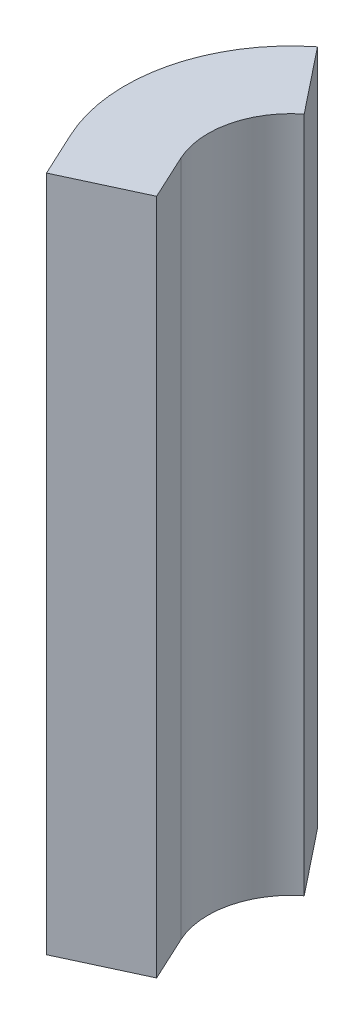
ISO-10303-21;
HEADER;
FILE_DESCRIPTION(('STEP AP214'),'2;1');
FILE_NAME('part.step','',(''),(''),'','','');
FILE_SCHEMA(('AUTOMOTIVE_DESIGN { 1 0 10303 214 1 1 1 1 }'));
ENDSEC;
DATA;
#1=APPLICATION_CONTEXT('core data for automotive mechanical design processes');
#2=APPLICATION_PROTOCOL_DEFINITION('international standard','automotive_design',2000,#1);
#3=PRODUCT_CONTEXT('',#1,'mechanical');
#4=PRODUCT('Part','Part','',(#3));
#5=PRODUCT_RELATED_PRODUCT_CATEGORY('part','',(#4));
#6=PRODUCT_DEFINITION_FORMATION('','',#4);
#7=PRODUCT_DEFINITION_CONTEXT('part definition',#1,'design');
#8=PRODUCT_DEFINITION('design','',#6,#7);
#9=PRODUCT_DEFINITION_SHAPE('','',#8);
#10=(LENGTH_UNIT() NAMED_UNIT(*) SI_UNIT(.MILLI.,.METRE.));
#11=(NAMED_UNIT(*) PLANE_ANGLE_UNIT() SI_UNIT($,.RADIAN.));
#12=(NAMED_UNIT(*) SI_UNIT($,.STERADIAN.) SOLID_ANGLE_UNIT());
#13=UNCERTAINTY_MEASURE_WITH_UNIT(LENGTH_MEASURE(1.E-05),#10,'distance_accuracy_value','');
#14=(GEOMETRIC_REPRESENTATION_CONTEXT(3) GLOBAL_UNCERTAINTY_ASSIGNED_CONTEXT((#13)) GLOBAL_UNIT_ASSIGNED_CONTEXT((#10,
#11,#12)) REPRESENTATION_CONTEXT('',''));
#15=CARTESIAN_POINT('',(0.,0.,0.));
#16=DIRECTION('',(0.,0.,1.));
#17=DIRECTION('',(1.,0.,0.));
#18=AXIS2_PLACEMENT_3D('',#15,#16,#17);
#19=CARTESIAN_POINT('',(-61.65511113749,18.50356883068,14.46365545589));
#20=DIRECTION('',(0.906947316959086,0.,-0.421244067329993));
#21=DIRECTION('',(-0.421244067329993,0.,-0.906947316959086));
#22=AXIS2_PLACEMENT_3D('',#19,#20,#21);
#23=PLANE('',#22);
#24=DIRECTION('',(0.,1.,0.));
#25=VECTOR('',#24,1.);
#26=CARTESIAN_POINT('',(-60.8957025953721,30.75356883068,16.0986779836054));
#27=LINE('',#26,#25);
#28=CARTESIAN_POINT('',(-60.8957025953707,43.00356883068,16.0986779836085));
#29=VERTEX_POINT('',#28);
#30=CARTESIAN_POINT('',(-60.8957025953707,18.50356883068,16.0986779836085));
#31=VERTEX_POINT('',#30);
#32=EDGE_CURVE('E76',#29,#31,#27,.F.);
#33=ORIENTED_EDGE('',*,*,#32,.T.);
#34=DIRECTION('',(-0.421244067329295,0.,-0.90694731695941));
#35=VECTOR('',#34,1.);
#36=CARTESIAN_POINT('',(-60.89570259537,18.50356883068,16.09867798361));
#37=LINE('',#36,#35);
#38=CARTESIAN_POINT('',(-61.6551111374891,18.50356883068,14.4636554558889));
#39=VERTEX_POINT('',#38);
#40=EDGE_CURVE('E102',#31,#39,#37,.T.);
#41=ORIENTED_EDGE('',*,*,#40,.T.);
#42=DIRECTION('',(0.,-1.,0.));
#43=VECTOR('',#42,1.);
#44=CARTESIAN_POINT('',(-61.6551111374877,18.50356883068,14.4636554558889));
#45=LINE('',#44,#43);
#46=CARTESIAN_POINT('',(-61.6551111374891,43.00356883068,14.4636554558889));
#47=VERTEX_POINT('',#46);
#48=EDGE_CURVE('E60',#39,#47,#45,.F.);
#49=ORIENTED_EDGE('',*,*,#48,.T.);
#50=DIRECTION('',(-0.421244067329295,0.,-0.90694731695941));
#51=VECTOR('',#50,1.);
#52=CARTESIAN_POINT('',(-60.89570259537,43.00356883068,16.09867798361));
#53=LINE('',#52,#51);
#54=EDGE_CURVE('E82',#29,#47,#53,.T.);
#55=ORIENTED_EDGE('',*,*,#54,.F.);
#56=EDGE_LOOP('',(#33,#41,#49,#55));
#57=FACE_BOUND('',#56,.T.);
#58=ADVANCED_FACE('F17',(#57),#23,.T.);
#59=CARTESIAN_POINT('',(-62.25612357081,30.75356883068,16.7305440846));
#60=DIRECTION('',(-0.421244067329993,0.,-0.906947316959086));
#61=DIRECTION('',(-0.906947316959086,0.,0.421244067329993));
#62=AXIS2_PLACEMENT_3D('',#59,#60,#61);
#63=PLANE('',#62);
#64=DIRECTION('',(0.,1.,0.));
#65=VECTOR('',#64,1.);
#66=CARTESIAN_POINT('',(-63.6165445462487,18.50356883068,17.3624101855994));
#67=LINE('',#66,#65);
#68=CARTESIAN_POINT('',(-63.6165445462487,43.00356883068,17.3624101855994));
#69=VERTEX_POINT('',#68);
#70=CARTESIAN_POINT('',(-63.6165445462487,18.50356883068,17.3624101855994));
#71=VERTEX_POINT('',#70);
#72=EDGE_CURVE('E96',#69,#71,#67,.F.);
#73=ORIENTED_EDGE('',*,*,#72,.T.);
#74=DIRECTION('',(0.906947316959245,0.,-0.421244067329651));
#75=VECTOR('',#74,1.);
#76=CARTESIAN_POINT('',(-63.61654454625,18.50356883068,17.3624101856));
#77=LINE('',#76,#75);
#78=EDGE_CURVE('E79',#71,#31,#77,.T.);
#79=ORIENTED_EDGE('',*,*,#78,.T.);
#80=ORIENTED_EDGE('',*,*,#32,.F.);
#81=DIRECTION('',(0.906947316959245,0.,-0.421244067329651));
#82=VECTOR('',#81,1.);
#83=CARTESIAN_POINT('',(-63.61654454625,43.00356883068,17.3624101856));
#84=LINE('',#83,#82);
#85=EDGE_CURVE('E70',#69,#29,#84,.T.);
#86=ORIENTED_EDGE('',*,*,#85,.F.);
#87=EDGE_LOOP('',(#73,#79,#80,#86));
#88=FACE_BOUND('',#87,.T.);
#89=ADVANCED_FACE('F78',(#88),#63,.F.);
#90=CARTESIAN_POINT('',(-58.93426918661,18.50356883068,13.1999232539));
#91=DIRECTION('',(0.,-1.,0.));
#92=DIRECTION('',(0.,0.,-1.));
#93=AXIS2_PLACEMENT_3D('',#90,#91,#92);
#94=CYLINDRICAL_SURFACE('',#93,3.);
#95=CARTESIAN_POINT('',(-58.93426918661,43.00356883068,13.1999232539));
#96=DIRECTION('',(0.,-1.,0.));
#97=DIRECTION('',(0.,0.,-1.));
#98=AXIS2_PLACEMENT_3D('',#95,#96,#97);
#99=CIRCLE('',#98,3.);
#100=CARTESIAN_POINT('',(-60.8018130965253,43.00356883068,10.8520987833405));
#101=VERTEX_POINT('',#100);
#102=EDGE_CURVE('E20',#47,#101,#99,.T.);
#103=ORIENTED_EDGE('',*,*,#102,.F.);
#104=ORIENTED_EDGE('',*,*,#48,.F.);
#105=CARTESIAN_POINT('',(-58.93426918661,18.50356883068,13.1999232539));
#106=DIRECTION('',(0.,-1.,0.));
#107=DIRECTION('',(0.,0.,-1.));
#108=AXIS2_PLACEMENT_3D('',#105,#106,#107);
#109=CIRCLE('',#108,3.);
#110=CARTESIAN_POINT('',(-60.8018130965266,18.50356883068,10.8520987833415));
#111=VERTEX_POINT('',#110);
#112=EDGE_CURVE('E110',#39,#111,#109,.T.);
#113=ORIENTED_EDGE('',*,*,#112,.T.);
#114=DIRECTION('',(0.,1.,0.));
#115=VECTOR('',#114,1.);
#116=CARTESIAN_POINT('',(-60.8018130965273,30.75356883068,10.8520987833379));
#117=LINE('',#116,#115);
#118=EDGE_CURVE('E111',#101,#111,#117,.F.);
#119=ORIENTED_EDGE('',*,*,#118,.F.);
#120=EDGE_LOOP('',(#103,#104,#113,#119));
#121=FACE_BOUND('',#120,.T.);
#122=ADVANCED_FACE('F137',(#121),#94,.F.);
#123=CARTESIAN_POINT('',(-64.37595308837,18.50356883068,15.72738765788));
#124=DIRECTION('',(0.906947316959086,0.,-0.421244067329993));
#125=DIRECTION('',(-0.421244067329993,0.,-0.906947316959086));
#126=AXIS2_PLACEMENT_3D('',#123,#124,#125);
#127=PLANE('',#126);
#128=DIRECTION('',(-0.421244067329993,0.,-0.906947316959086));
#129=VECTOR('',#128,1.);
#130=CARTESIAN_POINT('',(-64.37595308837,43.00356883068,15.72738765788));
#131=LINE('',#130,#129);
#132=CARTESIAN_POINT('',(-64.3759530883672,43.00356883068,15.72738765788));
#133=VERTEX_POINT('',#132);
#134=EDGE_CURVE('E88',#133,#69,#131,.F.);
#135=ORIENTED_EDGE('',*,*,#134,.F.);
#136=DIRECTION('',(0.,-1.,0.));
#137=VECTOR('',#136,1.);
#138=CARTESIAN_POINT('',(-64.3759530883655,18.50356883068,15.7273876578779));
#139=LINE('',#138,#137);
#140=CARTESIAN_POINT('',(-64.3759530883672,18.50356883068,15.72738765788));
#141=VERTEX_POINT('',#140);
#142=EDGE_CURVE('E109',#141,#133,#139,.F.);
#143=ORIENTED_EDGE('',*,*,#142,.F.);
#144=DIRECTION('',(-0.421244067329993,0.,-0.906947316959086));
#145=VECTOR('',#144,1.);
#146=CARTESIAN_POINT('',(-64.37595308837,18.50356883068,15.72738765788));
#147=LINE('',#146,#145);
#148=EDGE_CURVE('E101',#71,#141,#147,.T.);
#149=ORIENTED_EDGE('',*,*,#148,.F.);
#150=ORIENTED_EDGE('',*,*,#72,.F.);
#151=EDGE_LOOP('',(#135,#143,#149,#150));
#152=FACE_BOUND('',#151,.T.);
#153=ADVANCED_FACE('F139',(#152),#127,.F.);
#154=CARTESIAN_POINT('',(-63.31369293337,43.00356883068,12.16520220631));
#155=DIRECTION('',(0.,1.,0.));
#156=DIRECTION('',(0.,0.,1.));
#157=AXIS2_PLACEMENT_3D('',#154,#155,#156);
#158=PLANE('',#157);
#159=CARTESIAN_POINT('',(-58.93426918661,43.00356883068,13.1999232539));
#160=DIRECTION('',(0.,-1.,0.));
#161=DIRECTION('',(0.,0.,-1.));
#162=AXIS2_PLACEMENT_3D('',#159,#160,#161);
#163=CIRCLE('',#162,6.);
#164=CARTESIAN_POINT('',(-62.6693570064373,43.00356883068,8.5042743127868));
#165=VERTEX_POINT('',#164);
#166=EDGE_CURVE('E107',#133,#165,#163,.T.);
#167=ORIENTED_EDGE('',*,*,#166,.F.);
#168=ORIENTED_EDGE('',*,*,#134,.T.);
#169=ORIENTED_EDGE('',*,*,#85,.T.);
#170=ORIENTED_EDGE('',*,*,#54,.T.);
#171=ORIENTED_EDGE('',*,*,#102,.T.);
#172=DIRECTION('',(-0.622514636637614,0.,-0.782608156852418));
#173=VECTOR('',#172,1.);
#174=CARTESIAN_POINT('',(-61.73558505148,43.00356883068,9.678186548064));
#175=LINE('',#174,#173);
#176=EDGE_CURVE('E116',#165,#101,#175,.F.);
#177=ORIENTED_EDGE('',*,*,#176,.F.);
#178=EDGE_LOOP('',(#167,#168,#169,#170,#171,#177));
#179=FACE_BOUND('',#178,.T.);
#180=ADVANCED_FACE('F87',(#179),#158,.T.);
#181=CARTESIAN_POINT('',(-61.73558505148,30.75356883068,9.678186548064));
#182=DIRECTION('',(0.782608156852418,0.,-0.622514636637614));
#183=DIRECTION('',(-0.622514636637614,0.,-0.782608156852418));
#184=AXIS2_PLACEMENT_3D('',#181,#182,#183);
#185=PLANE('',#184);
#186=ORIENTED_EDGE('',*,*,#176,.T.);
#187=ORIENTED_EDGE('',*,*,#118,.T.);
#188=DIRECTION('',(-0.622514636637565,0.,-0.782608156852457));
#189=VECTOR('',#188,1.);
#190=CARTESIAN_POINT('',(-60.80181309653,18.50356883068,10.85209878334));
#191=LINE('',#190,#189);
#192=CARTESIAN_POINT('',(-62.6693570064386,18.50356883068,8.50427431278779));
#193=VERTEX_POINT('',#192);
#194=EDGE_CURVE('E35',#111,#193,#191,.T.);
#195=ORIENTED_EDGE('',*,*,#194,.T.);
#196=DIRECTION('',(0.,-1.,0.));
#197=VECTOR('',#196,1.);
#198=CARTESIAN_POINT('',(-62.6693570064386,18.50356883068,8.50427431278779));
#199=LINE('',#198,#197);
#200=EDGE_CURVE('E26',#165,#193,#199,.T.);
#201=ORIENTED_EDGE('',*,*,#200,.F.);
#202=EDGE_LOOP('',(#186,#187,#195,#201));
#203=FACE_BOUND('',#202,.T.);
#204=ADVANCED_FACE('F136',(#203),#185,.T.);
#205=CARTESIAN_POINT('',(-63.31369293337,18.50356883068,12.16520220631));
#206=DIRECTION('',(0.,1.,0.));
#207=DIRECTION('',(0.,0.,1.));
#208=AXIS2_PLACEMENT_3D('',#205,#206,#207);
#209=PLANE('',#208);
#210=CARTESIAN_POINT('',(-58.93426918661,18.50356883068,13.1999232539));
#211=DIRECTION('',(0.,-1.,0.));
#212=DIRECTION('',(0.,0.,-1.));
#213=AXIS2_PLACEMENT_3D('',#210,#211,#212);
#214=CIRCLE('',#213,6.);
#215=EDGE_CURVE('E11',#193,#141,#214,.F.);
#216=ORIENTED_EDGE('',*,*,#215,.F.);
#217=ORIENTED_EDGE('',*,*,#194,.F.);
#218=ORIENTED_EDGE('',*,*,#112,.F.);
#219=ORIENTED_EDGE('',*,*,#40,.F.);
#220=ORIENTED_EDGE('',*,*,#78,.F.);
#221=ORIENTED_EDGE('',*,*,#148,.T.);
#222=EDGE_LOOP('',(#216,#217,#218,#219,#220,#221));
#223=FACE_BOUND('',#222,.T.);
#224=ADVANCED_FACE('F149',(#223),#209,.F.);
#225=CARTESIAN_POINT('',(-58.93426918661,18.50356883068,13.1999232539));
#226=DIRECTION('',(0.,-1.,0.));
#227=DIRECTION('',(0.,0.,-1.));
#228=AXIS2_PLACEMENT_3D('',#225,#226,#227);
#229=CYLINDRICAL_SURFACE('',#228,6.);
#230=ORIENTED_EDGE('',*,*,#200,.T.);
#231=ORIENTED_EDGE('',*,*,#215,.T.);
#232=ORIENTED_EDGE('',*,*,#142,.T.);
#233=ORIENTED_EDGE('',*,*,#166,.T.);
#234=EDGE_LOOP('',(#230,#231,#232,#233));
#235=FACE_BOUND('',#234,.T.);
#236=ADVANCED_FACE('F135',(#235),#229,.T.);
#237=CLOSED_SHELL('',(#58,#89,#122,#153,#180,#204,#224,#236));
#238=MANIFOLD_SOLID_BREP('B1',#237);
#239=ADVANCED_BREP_SHAPE_REPRESENTATION('',(#18,#238),#14);
#240=SHAPE_DEFINITION_REPRESENTATION(#9,#239);
ENDSEC;
END-ISO-10303-21;
